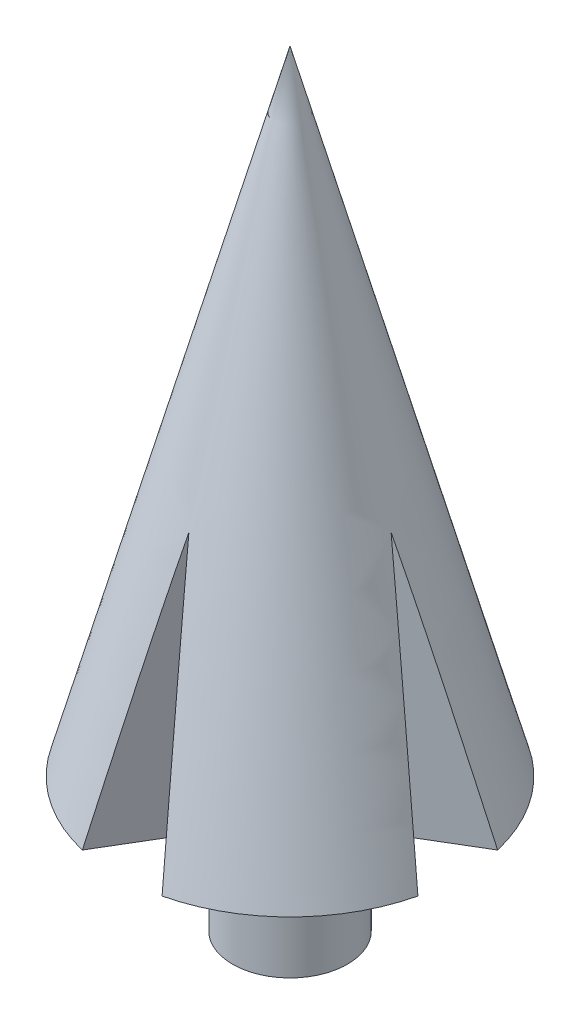
ISO-10303-21;
HEADER;
FILE_DESCRIPTION(('STEP AP214'),'2;1');
FILE_NAME('part.step','',(''),(''),'','','');
FILE_SCHEMA(('AUTOMOTIVE_DESIGN { 1 0 10303 214 1 1 1 1 }'));
ENDSEC;
DATA;
#1=APPLICATION_CONTEXT('core data for automotive mechanical design processes');
#2=APPLICATION_PROTOCOL_DEFINITION('international standard','automotive_design',2000,#1);
#3=PRODUCT_CONTEXT('',#1,'mechanical');
#4=PRODUCT('Part','Part','',(#3));
#5=PRODUCT_RELATED_PRODUCT_CATEGORY('part','',(#4));
#6=PRODUCT_DEFINITION_FORMATION('','',#4);
#7=PRODUCT_DEFINITION_CONTEXT('part definition',#1,'design');
#8=PRODUCT_DEFINITION('design','',#6,#7);
#9=PRODUCT_DEFINITION_SHAPE('','',#8);
#10=(LENGTH_UNIT() NAMED_UNIT(*) SI_UNIT(.MILLI.,.METRE.));
#11=(NAMED_UNIT(*) PLANE_ANGLE_UNIT() SI_UNIT($,.RADIAN.));
#12=(NAMED_UNIT(*) SI_UNIT($,.STERADIAN.) SOLID_ANGLE_UNIT());
#13=UNCERTAINTY_MEASURE_WITH_UNIT(LENGTH_MEASURE(1.E-05),#10,'distance_accuracy_value','');
#14=(GEOMETRIC_REPRESENTATION_CONTEXT(3) GLOBAL_UNCERTAINTY_ASSIGNED_CONTEXT((#13)) GLOBAL_UNIT_ASSIGNED_CONTEXT((#10,
#11,#12)) REPRESENTATION_CONTEXT('',''));
#15=CARTESIAN_POINT('',(0.,0.,0.));
#16=DIRECTION('',(0.,0.,1.));
#17=DIRECTION('',(1.,0.,0.));
#18=AXIS2_PLACEMENT_3D('',#15,#16,#17);
#19=CARTESIAN_POINT('',(-3.,0.,0.));
#20=DIRECTION('',(0.,-1.,0.));
#21=DIRECTION('',(1.,0.,0.));
#22=AXIS2_PLACEMENT_3D('',#19,#20,#21);
#23=PLANE('',#22);
#24=CARTESIAN_POINT('',(0.,0.,0.));
#25=DIRECTION('',(0.,1.,0.));
#26=DIRECTION('',(-1.,0.,0.));
#27=AXIS2_PLACEMENT_3D('',#24,#25,#26);
#28=CIRCLE('',#27,3.);
#29=CARTESIAN_POINT('',(-3.,0.,0.));
#30=VERTEX_POINT('',#29);
#31=EDGE_CURVE('E133',#30,#30,#28,.T.);
#32=ORIENTED_EDGE('',*,*,#31,.F.);
#33=EDGE_LOOP('',(#32));
#34=FACE_BOUND('',#33,.T.);
#35=ADVANCED_FACE('F35',(#34),#23,.T.);
#36=CARTESIAN_POINT('',(0.,40.,0.));
#37=DIRECTION('',(0.,1.,0.));
#38=DIRECTION('',(-1.,0.,0.));
#39=AXIS2_PLACEMENT_3D('',#36,#37,#38);
#40=CYLINDRICAL_SURFACE('',#39,3.);
#41=ORIENTED_EDGE('',*,*,#31,.T.);
#42=EDGE_LOOP('',(#41));
#43=FACE_BOUND('',#42,.T.);
#44=CARTESIAN_POINT('',(0.,7.,0.));
#45=DIRECTION('',(0.,1.,0.));
#46=DIRECTION('',(-1.,0.,0.));
#47=AXIS2_PLACEMENT_3D('',#44,#45,#46);
#48=CIRCLE('',#47,3.);
#49=CARTESIAN_POINT('',(-3.,7.,0.));
#50=VERTEX_POINT('',#49);
#51=EDGE_CURVE('E128',#50,#50,#48,.T.);
#52=ORIENTED_EDGE('',*,*,#51,.F.);
#53=EDGE_LOOP('',(#52));
#54=FACE_BOUND('',#53,.T.);
#55=ADVANCED_FACE('F229',(#43,#54),#40,.T.);
#56=CARTESIAN_POINT('',(-3.,7.,0.));
#57=DIRECTION('',(0.,-1.,0.));
#58=DIRECTION('',(1.,0.,0.));
#59=AXIS2_PLACEMENT_3D('',#56,#57,#58);
#60=PLANE('',#59);
#61=DIRECTION('',(0.512744050028074,0.,0.858541518600474));
#62=VECTOR('',#61,1.);
#63=CARTESIAN_POINT('',(0.,7.,5.27424816728477));
#64=LINE('',#63,#62);
#65=CARTESIAN_POINT('',(0.,7.,5.27424816728477));
#66=VERTEX_POINT('',#65);
#67=CARTESIAN_POINT('',(2.07965187716303,7.,8.756428956476));
#68=VERTEX_POINT('',#67);
#69=EDGE_CURVE('E120',#66,#68,#64,.T.);
#70=ORIENTED_EDGE('',*,*,#69,.F.);
#71=DIRECTION('',(0.512744050028075,0.,-0.858541518600474));
#72=VECTOR('',#71,1.);
#73=CARTESIAN_POINT('',(-2.07965187716305,7.,8.75642895647605));
#74=LINE('',#73,#72);
#75=CARTESIAN_POINT('',(-2.07965187716305,7.,8.75642895647605));
#76=VERTEX_POINT('',#75);
#77=EDGE_CURVE('E107',#76,#66,#74,.T.);
#78=ORIENTED_EDGE('',*,*,#77,.F.);
#79=CARTESIAN_POINT('',(0.,7.,0.));
#80=DIRECTION('',(0.,1.,0.));
#81=DIRECTION('',(-1.,0.,0.));
#82=AXIS2_PLACEMENT_3D('',#79,#80,#81);
#83=CIRCLE('',#82,9.);
#84=CARTESIAN_POINT('',(-8.75642895647603,7.,2.07965187716315));
#85=VERTEX_POINT('',#84);
#86=EDGE_CURVE('E118',#85,#76,#83,.T.);
#87=ORIENTED_EDGE('',*,*,#86,.F.);
#88=DIRECTION('',(-0.858541518600468,0.,0.512744050028083));
#89=VECTOR('',#88,1.);
#90=CARTESIAN_POINT('',(-5.27424816728477,7.,0.));
#91=LINE('',#90,#89);
#92=CARTESIAN_POINT('',(-5.27424816728477,7.,0.));
#93=VERTEX_POINT('',#92);
#94=EDGE_CURVE('E162',#93,#85,#91,.T.);
#95=ORIENTED_EDGE('',*,*,#94,.F.);
#96=DIRECTION('',(0.858541518600479,0.,0.512744050028065));
#97=VECTOR('',#96,1.);
#98=CARTESIAN_POINT('',(-8.75642895647607,7.,-2.07965187716296));
#99=LINE('',#98,#97);
#100=CARTESIAN_POINT('',(-8.75642895647607,7.,-2.07965187716296));
#101=VERTEX_POINT('',#100);
#102=EDGE_CURVE('E159',#101,#93,#99,.T.);
#103=ORIENTED_EDGE('',*,*,#102,.F.);
#104=CARTESIAN_POINT('',(-2.07965187716312,7.,-8.75642895647603));
#105=VERTEX_POINT('',#104);
#106=EDGE_CURVE('E131',#105,#101,#83,.T.);
#107=ORIENTED_EDGE('',*,*,#106,.F.);
#108=DIRECTION('',(-0.51274405002808,0.,-0.85854151860047));
#109=VECTOR('',#108,1.);
#110=CARTESIAN_POINT('',(0.,7.,-5.27424816728477));
#111=LINE('',#110,#109);
#112=CARTESIAN_POINT('',(0.,7.,-5.27424816728477));
#113=VERTEX_POINT('',#112);
#114=EDGE_CURVE('E155',#113,#105,#111,.T.);
#115=ORIENTED_EDGE('',*,*,#114,.F.);
#116=DIRECTION('',(-0.512744050028069,0.,0.858541518600477));
#117=VECTOR('',#116,1.);
#118=CARTESIAN_POINT('',(2.07965187716299,7.,-8.75642895647606));
#119=LINE('',#118,#117);
#120=CARTESIAN_POINT('',(2.07965187716299,7.,-8.75642895647606));
#121=VERTEX_POINT('',#120);
#122=EDGE_CURVE('E152',#121,#113,#119,.T.);
#123=ORIENTED_EDGE('',*,*,#122,.F.);
#124=CARTESIAN_POINT('',(8.75642895647604,7.,-2.07965187716308));
#125=VERTEX_POINT('',#124);
#126=EDGE_CURVE('E136',#125,#121,#83,.T.);
#127=ORIENTED_EDGE('',*,*,#126,.F.);
#128=DIRECTION('',(0.858541518600472,0.,-0.512744050028077));
#129=VECTOR('',#128,1.);
#130=CARTESIAN_POINT('',(5.27424816728477,7.,0.));
#131=LINE('',#130,#129);
#132=CARTESIAN_POINT('',(5.27424816728477,7.,0.));
#133=VERTEX_POINT('',#132);
#134=EDGE_CURVE('E148',#133,#125,#131,.T.);
#135=ORIENTED_EDGE('',*,*,#134,.F.);
#136=DIRECTION('',(-0.858541518600475,0.,-0.512744050028072));
#137=VECTOR('',#136,1.);
#138=CARTESIAN_POINT('',(8.75642895647606,7.,2.07965187716302));
#139=LINE('',#138,#137);
#140=CARTESIAN_POINT('',(8.75642895647606,7.,2.07965187716302));
#141=VERTEX_POINT('',#140);
#142=EDGE_CURVE('E146',#141,#133,#139,.T.);
#143=ORIENTED_EDGE('',*,*,#142,.F.);
#144=EDGE_CURVE('E129',#68,#141,#83,.T.);
#145=ORIENTED_EDGE('',*,*,#144,.F.);
#146=EDGE_LOOP('',(#70,#78,#87,#95,#103,#107,#115,#123,#127,#135,#143,#145));
#147=FACE_BOUND('',#146,.T.);
#148=ORIENTED_EDGE('',*,*,#51,.T.);
#149=EDGE_LOOP('',(#148));
#150=FACE_BOUND('',#149,.T.);
#151=ADVANCED_FACE('F115',(#147,#150),#60,.T.);
#152=CARTESIAN_POINT('',(0.,40.,0.));
#153=DIRECTION('',(0.,-1.,0.));
#154=DIRECTION('',(1.,0.,0.));
#155=AXIS2_PLACEMENT_3D('',#152,#153,#154);
#156=CONICAL_SURFACE('',#155,0.,0.266252049150925);
#157=CARTESIAN_POINT('',(2.07968120009996,6.9998,8.75647805496638));
#158=CARTESIAN_POINT('',(1.99597046206552,7.57074781923847,8.61631232481053));
#159=CARTESIAN_POINT('',(1.91206399469073,8.14158623715269,8.47581886434734));
#160=CARTESIAN_POINT('',(1.74377442181958,9.28299574479061,8.19403385787186));
#161=CARTESIAN_POINT('',(1.65939131630522,9.85356683450422,8.05274231182944));
#162=CARTESIAN_POINT('',(1.40540677342312,11.564755791778,7.62746916602675));
#163=CARTESIAN_POINT('',(1.23496271858329,12.7048998699524,7.34207668283637));
#164=CARTESIAN_POINT('',(0.976727581957362,14.4136621966977,6.9096863189839));
#165=CARTESIAN_POINT('',(0.89021942653667,14.9830177089272,6.76483657743714));
#166=CARTESIAN_POINT('',(0.716109592753494,16.1210901344329,6.4733060933851));
#167=CARTESIAN_POINT('',(0.628507919510908,16.6898070506854,6.32662535945262));
#168=CARTESIAN_POINT('',(0.451891046525479,17.8264347500353,6.03089707487267));
#169=CARTESIAN_POINT('',(0.362875784578186,18.3943454964527,5.88184942006973));
#170=CARTESIAN_POINT('',(0.227941134679447,19.2453653041906,5.65591408404868));
#171=CARTESIAN_POINT('',(0.182727258890061,19.5288997799868,5.58020771635917));
#172=CARTESIAN_POINT('',(0.0917428663109262,20.0956299999954,5.42786293816125));
#173=CARTESIAN_POINT('',(0.0459723472011671,20.3788257427906,5.35122452376819));
#174=CARTESIAN_POINT('',(-0.000119445370763131,20.6618233816631,5.27404816728477));
#175=B_SPLINE_CURVE_WITH_KNOTS('',3,(#157,#158,#159,#160,#161,#162,#163,#164,#165,#166,#167,
#168,#169,#170,#171,#172,#173,#174),.UNSPECIFIED.,.F.,.F.,(4,2,2,2,2,2,2,2,4),(0.,
1.78149243202068,3.56298493130513,7.12581231456494,8.90729097451385,10.6887612966287,
12.4703102301186,13.3610989095809,14.2518913029986),.UNSPECIFIED.);
#176=CARTESIAN_POINT('',(0.,20.6610900532892,5.27424816728476));
#177=VERTEX_POINT('',#176);
#178=EDGE_CURVE('E11',#68,#177,#175,.T.);
#179=ORIENTED_EDGE('',*,*,#178,.F.);
#180=ORIENTED_EDGE('',*,*,#144,.T.);
#181=CARTESIAN_POINT('',(5.27404816728477,20.6618233816631,-0.000119445370782194));
#182=CARTESIAN_POINT('',(5.36449489982296,20.3301445989775,0.0538977721413489));
#183=CARTESIAN_POINT('',(5.45421000992396,19.9981965513433,0.107478045087138));
#184=CARTESIAN_POINT('',(5.63239347426585,19.3338487247317,0.213893994898884));
#185=CARTESIAN_POINT('',(5.72086183579515,19.0014489484075,0.266729676117688));
#186=CARTESIAN_POINT('',(5.89676762863575,18.3362870710858,0.37178533934469));
#187=CARTESIAN_POINT('',(5.98420508002976,18.0035249772849,0.42400533334682));
#188=CARTESIAN_POINT('',(6.15820635731955,17.3376906163127,0.527923568743354));
#189=CARTESIAN_POINT('',(6.24477018173963,17.0046183486185,0.579621809256434));
#190=CARTESIAN_POINT('',(6.50334158653126,16.0050440582446,0.734047595828097));
#191=CARTESIAN_POINT('',(6.67423768910008,15.3381519512079,0.836111337495469));
#192=CARTESIAN_POINT('',(7.01382067145912,14.0036025651177,1.03891941366075));
#193=CARTESIAN_POINT('',(7.18250753903349,13.3359452818553,1.13966374086303));
#194=CARTESIAN_POINT('',(7.4689049193096,12.1961237539031,1.31070794722778));
#195=CARTESIAN_POINT('',(7.58704359427547,11.7241053355188,1.38126353639218));
#196=CARTESIAN_POINT('',(7.82260176493649,10.7798264706347,1.52194520154778));
#197=CARTESIAN_POINT('',(7.94002126238759,10.3075660247289,1.59207127858769));
#198=CARTESIAN_POINT('',(8.29135664506592,8.89043965237907,1.8018982038205));
#199=CARTESIAN_POINT('',(8.52434149668639,7.94526028962358,1.94104301374164));
#200=CARTESIAN_POINT('',(8.7564780549664,6.99980000000001,2.07968120009994));
#201=B_SPLINE_CURVE_WITH_KNOTS('',3,(#181,#182,#183,#184,#185,#186,#187,#188,#189,#190,#191,
#192,#193,#194,#195,#196,#197,#198,#199,#200),.UNSPECIFIED.,.F.,.F.,(4,2,2,2,2,2,2,2,2,4),(0.,
1.04401969861891,2.08803329141528,3.13202651252509,4.1760214968092,6.2639091720207,
8.35180838722158,9.82680787193333,11.3018037538276,14.2518942731754),.UNSPECIFIED.);
#202=CARTESIAN_POINT('',(5.27424816728476,20.6610900532892,0.));
#203=VERTEX_POINT('',#202);
#204=EDGE_CURVE('E178',#203,#141,#201,.T.);
#205=ORIENTED_EDGE('',*,*,#204,.F.);
#206=CARTESIAN_POINT('',(8.75647805496638,6.9998,-2.07968120009999));
#207=CARTESIAN_POINT('',(8.61631232481052,7.57074781923847,-1.99597046206555));
#208=CARTESIAN_POINT('',(8.47581886434733,8.14158623715268,-1.91206399469076));
#209=CARTESIAN_POINT('',(8.19403385787186,9.28299574479061,-1.74377442181961));
#210=CARTESIAN_POINT('',(8.05274231182943,9.85356683450422,-1.65939131630525));
#211=CARTESIAN_POINT('',(7.62746916602675,11.564755791778,-1.40540677342315));
#212=CARTESIAN_POINT('',(7.34207668283636,12.7048998699524,-1.23496271858332));
#213=CARTESIAN_POINT('',(6.9096863189839,14.4136621966977,-0.976727581957386));
#214=CARTESIAN_POINT('',(6.76483657743713,14.9830177089272,-0.890219426536693));
#215=CARTESIAN_POINT('',(6.4733060933851,16.1210901344329,-0.716109592753515));
#216=CARTESIAN_POINT('',(6.32662535945262,16.6898070506854,-0.628507919510929));
#217=CARTESIAN_POINT('',(6.03089707487267,17.8264347500353,-0.451891046525499));
#218=CARTESIAN_POINT('',(5.88184942006973,18.3943454964527,-0.362875784578206));
#219=CARTESIAN_POINT('',(5.65591408404868,19.2453653041906,-0.227941134679465));
#220=CARTESIAN_POINT('',(5.58020771635917,19.5288997799868,-0.182727258890079));
#221=CARTESIAN_POINT('',(5.42786293816125,20.0956299999954,-0.0917428663109441));
#222=CARTESIAN_POINT('',(5.35122452376819,20.3788257427906,-0.0459723472011848));
#223=CARTESIAN_POINT('',(5.27404816728477,20.6618233816631,0.000119445370745594));
#224=B_SPLINE_CURVE_WITH_KNOTS('',3,(#206,#207,#208,#209,#210,#211,#212,#213,#214,#215,#216,
#217,#218,#219,#220,#221,#222,#223),.UNSPECIFIED.,.F.,.F.,(4,2,2,2,2,2,2,2,4),(0.,
1.78149243202068,3.56298493130513,7.12581231456494,8.90729097451385,10.6887612966287,
12.4703102301186,13.3610989095809,14.2518913029986),.UNSPECIFIED.);
#225=EDGE_CURVE('E112',#125,#203,#224,.T.);
#226=ORIENTED_EDGE('',*,*,#225,.F.);
#227=ORIENTED_EDGE('',*,*,#126,.T.);
#228=CARTESIAN_POINT('',(-0.000119445370799965,20.6618233816631,-5.27404816728477));
#229=CARTESIAN_POINT('',(0.0538977721413297,20.3301445989775,-5.36449489982295));
#230=CARTESIAN_POINT('',(0.107478045087119,19.9981965513433,-5.45421000992396));
#231=CARTESIAN_POINT('',(0.213893994898865,19.3338487247317,-5.63239347426585));
#232=CARTESIAN_POINT('',(0.266729676117669,19.0014489484075,-5.72086183579515));
#233=CARTESIAN_POINT('',(0.37178533934467,18.3362870710858,-5.89676762863575));
#234=CARTESIAN_POINT('',(0.424005333346799,18.0035249772849,-5.98420508002976));
#235=CARTESIAN_POINT('',(0.527923568743332,17.3376906163127,-6.15820635731955));
#236=CARTESIAN_POINT('',(0.579621809256412,17.0046183486185,-6.24477018173963));
#237=CARTESIAN_POINT('',(0.734047595828075,16.0050440582446,-6.50334158653126));
#238=CARTESIAN_POINT('',(0.836111337495446,15.3381519512079,-6.67423768910009));
#239=CARTESIAN_POINT('',(1.03891941366073,14.0036025651177,-7.01382067145912));
#240=CARTESIAN_POINT('',(1.13966374086301,13.3359452818553,-7.18250753903349));
#241=CARTESIAN_POINT('',(1.31070794722776,12.1961237539031,-7.4689049193096));
#242=CARTESIAN_POINT('',(1.38126353639215,11.7241053355188,-7.58704359427548));
#243=CARTESIAN_POINT('',(1.52194520154775,10.7798264706347,-7.8226017649365));
#244=CARTESIAN_POINT('',(1.59207127858766,10.3075660247289,-7.9400212623876));
#245=CARTESIAN_POINT('',(1.80189820382047,8.89043965237907,-8.29135664506592));
#246=CARTESIAN_POINT('',(1.94104301374162,7.94526028962358,-8.5243414966864));
#247=CARTESIAN_POINT('',(2.07968120009991,6.9998,-8.75647805496641));
#248=B_SPLINE_CURVE_WITH_KNOTS('',3,(#228,#229,#230,#231,#232,#233,#234,#235,#236,#237,#238,
#239,#240,#241,#242,#243,#244,#245,#246,#247),.UNSPECIFIED.,.F.,.F.,(4,2,2,2,2,2,2,2,2,4),(0.,
1.04401969861891,2.08803329141528,3.13202651252509,4.1760214968092,6.2639091720207,
8.35180838722158,9.82680787193333,11.3018037538276,14.2518942731754),.UNSPECIFIED.);
#249=CARTESIAN_POINT('',(0.,20.6610900532892,-5.27424816728476));
#250=VERTEX_POINT('',#249);
#251=EDGE_CURVE('E177',#250,#121,#248,.T.);
#252=ORIENTED_EDGE('',*,*,#251,.F.);
#253=CARTESIAN_POINT('',(-2.07968120010003,6.9998,-8.75647805496637));
#254=CARTESIAN_POINT('',(-1.99597046206558,7.57074781923846,-8.61631232481051));
#255=CARTESIAN_POINT('',(-1.91206399469079,8.14158623715268,-8.47581886434733));
#256=CARTESIAN_POINT('',(-1.74377442181964,9.28299574479061,-8.19403385787185));
#257=CARTESIAN_POINT('',(-1.65939131630528,9.85356683450422,-8.05274231182943));
#258=CARTESIAN_POINT('',(-1.40540677342317,11.564755791778,-7.62746916602674));
#259=CARTESIAN_POINT('',(-1.23496271858334,12.7048998699524,-7.34207668283636));
#260=CARTESIAN_POINT('',(-0.97672758195741,14.4136621966977,-6.90968631898389));
#261=CARTESIAN_POINT('',(-0.890219426536716,14.9830177089272,-6.76483657743713));
#262=CARTESIAN_POINT('',(-0.716109592753538,16.1210901344329,-6.4733060933851));
#263=CARTESIAN_POINT('',(-0.628507919510952,16.6898070506854,-6.32662535945262));
#264=CARTESIAN_POINT('',(-0.45189104652552,17.8264347500353,-6.03089707487267));
#265=CARTESIAN_POINT('',(-0.362875784578227,18.3943454964527,-5.88184942006973));
#266=CARTESIAN_POINT('',(-0.227941134679486,19.2453653041906,-5.65591408404868));
#267=CARTESIAN_POINT('',(-0.182727258890099,19.5288997799868,-5.58020771635917));
#268=CARTESIAN_POINT('',(-0.0917428663109635,20.0956299999954,-5.42786293816125));
#269=CARTESIAN_POINT('',(-0.0459723472012039,20.3788257427906,-5.35122452376819));
#270=CARTESIAN_POINT('',(0.000119445370727092,20.6618233816631,-5.27404816728477));
#271=B_SPLINE_CURVE_WITH_KNOTS('',3,(#253,#254,#255,#256,#257,#258,#259,#260,#261,#262,#263,
#264,#265,#266,#267,#268,#269,#270),.UNSPECIFIED.,.F.,.F.,(4,2,2,2,2,2,2,2,4),(0.,
1.78149243202068,3.56298493130513,7.12581231456494,8.90729097451385,10.6887612966287,
12.4703102301186,13.3610989095809,14.2518913029986),.UNSPECIFIED.);
#272=EDGE_CURVE('E175',#105,#250,#271,.T.);
#273=ORIENTED_EDGE('',*,*,#272,.F.);
#274=ORIENTED_EDGE('',*,*,#106,.T.);
#275=CARTESIAN_POINT('',(-5.27404816728477,20.6618233816631,0.000119445370819474));
#276=CARTESIAN_POINT('',(-5.36449489982295,20.3301445989775,-0.0538977721413099));
#277=CARTESIAN_POINT('',(-5.45421000992397,19.9981965513433,-0.107478045087099));
#278=CARTESIAN_POINT('',(-5.63239347426585,19.3338487247317,-0.213893994898844));
#279=CARTESIAN_POINT('',(-5.72086183579515,19.0014489484075,-0.266729676117648));
#280=CARTESIAN_POINT('',(-5.89676762863576,18.3362870710858,-0.371785339344648));
#281=CARTESIAN_POINT('',(-5.98420508002976,18.0035249772849,-0.424005333346777));
#282=CARTESIAN_POINT('',(-6.15820635731955,17.3376906163127,-0.527923568743309));
#283=CARTESIAN_POINT('',(-6.24477018173963,17.0046183486185,-0.579621809256389));
#284=CARTESIAN_POINT('',(-6.50334158653127,16.0050440582446,-0.734047595828051));
#285=CARTESIAN_POINT('',(-6.67423768910009,15.3381519512079,-0.836111337495421));
#286=CARTESIAN_POINT('',(-7.01382067145913,14.0036025651177,-1.0389194136607));
#287=CARTESIAN_POINT('',(-7.18250753903349,13.3359452818553,-1.13966374086298));
#288=CARTESIAN_POINT('',(-7.46890491930961,12.1961237539031,-1.31070794722773));
#289=CARTESIAN_POINT('',(-7.58704359427548,11.7241053355188,-1.38126353639212));
#290=CARTESIAN_POINT('',(-7.8226017649365,10.7798264706347,-1.52194520154772));
#291=CARTESIAN_POINT('',(-7.9400212623876,10.3075660247289,-1.59207127858763));
#292=CARTESIAN_POINT('',(-8.29135664506593,8.89043965237907,-1.80189820382044));
#293=CARTESIAN_POINT('',(-8.52434149668641,7.94526028962358,-1.94104301374158));
#294=CARTESIAN_POINT('',(-8.75647805496642,6.9998,-2.07968120009988));
#295=B_SPLINE_CURVE_WITH_KNOTS('',3,(#275,#276,#277,#278,#279,#280,#281,#282,#283,#284,#285,
#286,#287,#288,#289,#290,#291,#292,#293,#294),.UNSPECIFIED.,.F.,.F.,(4,2,2,2,2,2,2,2,2,4),(0.,
1.04401969861891,2.08803329141529,3.13202651252509,4.1760214968092,6.2639091720207,
8.35180838722158,9.82680787193333,11.3018037538276,14.2518942731755),.UNSPECIFIED.);
#296=CARTESIAN_POINT('',(-5.27424816728476,20.6610900532892,0.));
#297=VERTEX_POINT('',#296);
#298=EDGE_CURVE('E168',#297,#101,#295,.T.);
#299=ORIENTED_EDGE('',*,*,#298,.F.);
#300=CARTESIAN_POINT('',(-8.75647805496636,6.9998,2.07968120010006));
#301=CARTESIAN_POINT('',(-8.6163123248105,7.57074781923847,1.99597046206561));
#302=CARTESIAN_POINT('',(-8.47581886434732,8.14158623715269,1.91206399469082));
#303=CARTESIAN_POINT('',(-8.19403385787184,9.28299574479061,1.74377442181967));
#304=CARTESIAN_POINT('',(-8.05274231182942,9.85356683450422,1.65939131630531));
#305=CARTESIAN_POINT('',(-7.62746916602674,11.564755791778,1.4054067734232));
#306=CARTESIAN_POINT('',(-7.34207668283635,12.7048998699524,1.23496271858337));
#307=CARTESIAN_POINT('',(-6.90968631898389,14.4136621966977,0.976727581957434));
#308=CARTESIAN_POINT('',(-6.76483657743713,14.9830177089272,0.89021942653674));
#309=CARTESIAN_POINT('',(-6.4733060933851,16.1210901344329,0.716109592753561));
#310=CARTESIAN_POINT('',(-6.32662535945261,16.6898070506854,0.628507919510974));
#311=CARTESIAN_POINT('',(-6.03089707487267,17.8264347500353,0.451891046525542));
#312=CARTESIAN_POINT('',(-5.88184942006973,18.3943454964527,0.362875784578247));
#313=CARTESIAN_POINT('',(-5.65591408404868,19.2453653041906,0.227941134679506));
#314=CARTESIAN_POINT('',(-5.58020771635917,19.5288997799868,0.182727258890119));
#315=CARTESIAN_POINT('',(-5.42786293816125,20.0956299999954,0.0917428663109831));
#316=CARTESIAN_POINT('',(-5.35122452376819,20.3788257427906,0.045972347201223));
#317=CARTESIAN_POINT('',(-5.27404816728477,20.6618233816631,-0.000119445370708319));
#318=B_SPLINE_CURVE_WITH_KNOTS('',3,(#300,#301,#302,#303,#304,#305,#306,#307,#308,#309,#310,
#311,#312,#313,#314,#315,#316,#317),.UNSPECIFIED.,.F.,.F.,(4,2,2,2,2,2,2,2,4),(0.,
1.78149243202068,3.56298493130513,7.12581231456494,8.90729097451385,10.6887612966287,
12.4703102301186,13.3610989095809,14.2518913029986),.UNSPECIFIED.);
#319=EDGE_CURVE('E127',#85,#297,#318,.T.);
#320=ORIENTED_EDGE('',*,*,#319,.F.);
#321=ORIENTED_EDGE('',*,*,#86,.T.);
#322=CARTESIAN_POINT('',(0.000119445370764769,20.6618233816631,5.27404816728477));
#323=CARTESIAN_POINT('',(-0.053897772141365,20.3301445989775,5.36449489982295));
#324=CARTESIAN_POINT('',(-0.107478045087155,19.9981965513433,5.45421000992396));
#325=CARTESIAN_POINT('',(-0.213893994898902,19.3338487247317,5.63239347426584));
#326=CARTESIAN_POINT('',(-0.266729676117707,19.0014489484075,5.72086183579515));
#327=CARTESIAN_POINT('',(-0.371785339344709,18.3362870710858,5.89676762863575));
#328=CARTESIAN_POINT('',(-0.424005333346839,18.0035249772849,5.98420508002976));
#329=CARTESIAN_POINT('',(-0.527923568743373,17.3376906163127,6.15820635731954));
#330=CARTESIAN_POINT('',(-0.579621809256454,17.0046183486185,6.24477018173963));
#331=CARTESIAN_POINT('',(-0.734047595828118,16.0050440582447,6.50334158653126));
#332=CARTESIAN_POINT('',(-0.836111337495491,15.3381519512079,6.67423768910008));
#333=CARTESIAN_POINT('',(-1.03891941366077,14.0036025651177,7.01382067145911));
#334=CARTESIAN_POINT('',(-1.13966374086306,13.3359452818553,7.18250753903348));
#335=CARTESIAN_POINT('',(-1.31070794722781,12.1961237539031,7.46890491930959));
#336=CARTESIAN_POINT('',(-1.3812635363922,11.7241053355188,7.58704359427547));
#337=CARTESIAN_POINT('',(-1.52194520154781,10.7798264706347,7.82260176493649));
#338=CARTESIAN_POINT('',(-1.59207127858772,10.3075660247289,7.94002126238759));
#339=CARTESIAN_POINT('',(-1.80189820382053,8.89043965237907,8.29135664506591));
#340=CARTESIAN_POINT('',(-1.94104301374167,7.94526028962358,8.52434149668639));
#341=CARTESIAN_POINT('',(-2.07968120009997,6.99980000000001,8.75647805496639));
#342=B_SPLINE_CURVE_WITH_KNOTS('',3,(#322,#323,#324,#325,#326,#327,#328,#329,#330,#331,#332,
#333,#334,#335,#336,#337,#338,#339,#340,#341),.UNSPECIFIED.,.F.,.F.,(4,2,2,2,2,2,2,2,2,4),(0.,
1.0440196986189,2.08803329141528,3.13202651252508,4.1760214968092,6.2639091720207,
8.35180838722158,9.82680787193333,11.3018037538276,14.2518942731754),.UNSPECIFIED.);
#343=EDGE_CURVE('E48',#177,#76,#342,.T.);
#344=ORIENTED_EDGE('',*,*,#343,.F.);
#345=EDGE_LOOP('',(#179,#180,#205,#226,#227,#252,#273,#274,#299,#320,#321,#344));
#346=FACE_BOUND('',#345,.T.);
#347=CARTESIAN_POINT('',(0.,40.,0.));
#348=VERTEX_POINT('',#347);
#349=VERTEX_LOOP('',#348);
#350=FACE_BOUND('',#349,.T.);
#351=ADVANCED_FACE('F123',(#346,#350),#156,.T.);
#352=CARTESIAN_POINT('',(-5.27424816728477,22.,0.));
#353=DIRECTION('',(0.512744050028083,0.,0.858541518600468));
#354=DIRECTION('',(0.858541518600468,0.,-0.512744050028083));
#355=AXIS2_PLACEMENT_3D('',#352,#353,#354);
#356=PLANE('',#355);
#357=ORIENTED_EDGE('',*,*,#319,.T.);
#358=DIRECTION('',(0.,-1.,0.));
#359=VECTOR('',#358,1.);
#360=CARTESIAN_POINT('',(-5.27424816728477,22.,0.));
#361=LINE('',#360,#359);
#362=EDGE_CURVE('E156',#297,#93,#361,.T.);
#363=ORIENTED_EDGE('',*,*,#362,.T.);
#364=ORIENTED_EDGE('',*,*,#94,.T.);
#365=EDGE_LOOP('',(#357,#363,#364));
#366=FACE_BOUND('',#365,.T.);
#367=ADVANCED_FACE('F164',(#366),#356,.F.);
#368=CARTESIAN_POINT('',(-8.75642895647607,22.,-2.07965187716296));
#369=DIRECTION('',(0.512744050028065,0.,-0.858541518600479));
#370=DIRECTION('',(-0.858541518600479,0.,-0.512744050028065));
#371=AXIS2_PLACEMENT_3D('',#368,#369,#370);
#372=PLANE('',#371);
#373=ORIENTED_EDGE('',*,*,#298,.T.);
#374=ORIENTED_EDGE('',*,*,#102,.T.);
#375=ORIENTED_EDGE('',*,*,#362,.F.);
#376=EDGE_LOOP('',(#373,#374,#375));
#377=FACE_BOUND('',#376,.T.);
#378=ADVANCED_FACE('F167',(#377),#372,.F.);
#379=CARTESIAN_POINT('',(0.,22.,-5.27424816728477));
#380=DIRECTION('',(-0.85854151860047,0.,0.51274405002808));
#381=DIRECTION('',(0.51274405002808,0.,0.85854151860047));
#382=AXIS2_PLACEMENT_3D('',#379,#380,#381);
#383=PLANE('',#382);
#384=ORIENTED_EDGE('',*,*,#272,.T.);
#385=DIRECTION('',(0.,-1.,0.));
#386=VECTOR('',#385,1.);
#387=CARTESIAN_POINT('',(0.,22.,-5.27424816728477));
#388=LINE('',#387,#386);
#389=EDGE_CURVE('E149',#250,#113,#388,.T.);
#390=ORIENTED_EDGE('',*,*,#389,.T.);
#391=ORIENTED_EDGE('',*,*,#114,.T.);
#392=EDGE_LOOP('',(#384,#390,#391));
#393=FACE_BOUND('',#392,.T.);
#394=ADVANCED_FACE('F174',(#393),#383,.F.);
#395=CARTESIAN_POINT('',(2.07965187716299,22.,-8.75642895647606));
#396=DIRECTION('',(0.858541518600477,0.,0.512744050028069));
#397=DIRECTION('',(0.512744050028069,0.,-0.858541518600477));
#398=AXIS2_PLACEMENT_3D('',#395,#396,#397);
#399=PLANE('',#398);
#400=ORIENTED_EDGE('',*,*,#251,.T.);
#401=ORIENTED_EDGE('',*,*,#122,.T.);
#402=ORIENTED_EDGE('',*,*,#389,.F.);
#403=EDGE_LOOP('',(#400,#401,#402));
#404=FACE_BOUND('',#403,.T.);
#405=ADVANCED_FACE('F204',(#404),#399,.F.);
#406=CARTESIAN_POINT('',(5.27424816728477,22.,0.));
#407=DIRECTION('',(-0.512744050028077,0.,-0.858541518600472));
#408=DIRECTION('',(-0.858541518600472,0.,0.512744050028077));
#409=AXIS2_PLACEMENT_3D('',#406,#407,#408);
#410=PLANE('',#409);
#411=ORIENTED_EDGE('',*,*,#225,.T.);
#412=DIRECTION('',(0.,-1.,0.));
#413=VECTOR('',#412,1.);
#414=CARTESIAN_POINT('',(5.27424816728477,22.,0.));
#415=LINE('',#414,#413);
#416=EDGE_CURVE('E62',#203,#133,#415,.T.);
#417=ORIENTED_EDGE('',*,*,#416,.T.);
#418=ORIENTED_EDGE('',*,*,#134,.T.);
#419=EDGE_LOOP('',(#411,#417,#418));
#420=FACE_BOUND('',#419,.T.);
#421=ADVANCED_FACE('F211',(#420),#410,.F.);
#422=CARTESIAN_POINT('',(8.75642895647606,22.,2.07965187716302));
#423=DIRECTION('',(-0.512744050028072,0.,0.858541518600475));
#424=DIRECTION('',(0.858541518600475,0.,0.512744050028072));
#425=AXIS2_PLACEMENT_3D('',#422,#423,#424);
#426=PLANE('',#425);
#427=ORIENTED_EDGE('',*,*,#204,.T.);
#428=ORIENTED_EDGE('',*,*,#142,.T.);
#429=ORIENTED_EDGE('',*,*,#416,.F.);
#430=EDGE_LOOP('',(#427,#428,#429));
#431=FACE_BOUND('',#430,.T.);
#432=ADVANCED_FACE('F205',(#431),#426,.F.);
#433=CARTESIAN_POINT('',(0.,22.,5.27424816728477));
#434=DIRECTION('',(0.858541518600474,0.,-0.512744050028074));
#435=DIRECTION('',(-0.512744050028074,0.,-0.858541518600474));
#436=AXIS2_PLACEMENT_3D('',#433,#434,#435);
#437=PLANE('',#436);
#438=ORIENTED_EDGE('',*,*,#178,.T.);
#439=DIRECTION('',(0.,-1.,0.));
#440=VECTOR('',#439,1.);
#441=CARTESIAN_POINT('',(0.,22.,5.27424816728477));
#442=LINE('',#441,#440);
#443=EDGE_CURVE('E55',#177,#66,#442,.T.);
#444=ORIENTED_EDGE('',*,*,#443,.T.);
#445=ORIENTED_EDGE('',*,*,#69,.T.);
#446=EDGE_LOOP('',(#438,#444,#445));
#447=FACE_BOUND('',#446,.T.);
#448=ADVANCED_FACE('F275',(#447),#437,.F.);
#449=CARTESIAN_POINT('',(-2.07965187716305,22.,8.75642895647605));
#450=DIRECTION('',(-0.858541518600474,0.,-0.512744050028075));
#451=DIRECTION('',(-0.512744050028075,0.,0.858541518600474));
#452=AXIS2_PLACEMENT_3D('',#449,#450,#451);
#453=PLANE('',#452);
#454=ORIENTED_EDGE('',*,*,#343,.T.);
#455=ORIENTED_EDGE('',*,*,#77,.T.);
#456=ORIENTED_EDGE('',*,*,#443,.F.);
#457=EDGE_LOOP('',(#454,#455,#456));
#458=FACE_BOUND('',#457,.T.);
#459=ADVANCED_FACE('F106',(#458),#453,.F.);
#460=CLOSED_SHELL('',(#35,#55,#151,#351,#367,#378,#394,#405,#421,#432,#448,#459));
#461=MANIFOLD_SOLID_BREP('B2',#460);
#462=ADVANCED_BREP_SHAPE_REPRESENTATION('',(#18,#461),#14);
#463=SHAPE_DEFINITION_REPRESENTATION(#9,#462);
ENDSEC;
END-ISO-10303-21;
